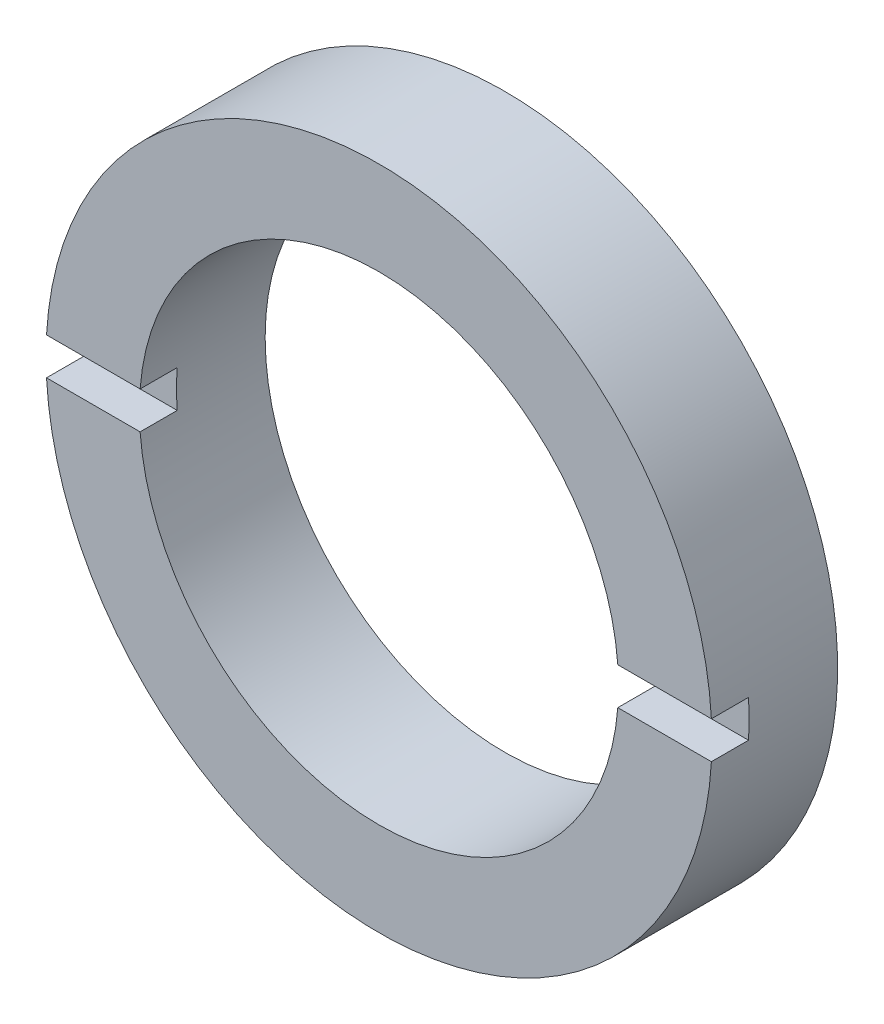
ISO-10303-21;
HEADER;
FILE_DESCRIPTION(('STEP AP214'),'2;1');
FILE_NAME('part.step','',(''),(''),'','','');
FILE_SCHEMA(('AUTOMOTIVE_DESIGN { 1 0 10303 214 1 1 1 1 }'));
ENDSEC;
DATA;
#1=APPLICATION_CONTEXT('core data for automotive mechanical design processes');
#2=APPLICATION_PROTOCOL_DEFINITION('international standard','automotive_design',2000,#1);
#3=PRODUCT_CONTEXT('',#1,'mechanical');
#4=PRODUCT('Part','Part','',(#3));
#5=PRODUCT_RELATED_PRODUCT_CATEGORY('part','',(#4));
#6=PRODUCT_DEFINITION_FORMATION('','',#4);
#7=PRODUCT_DEFINITION_CONTEXT('part definition',#1,'design');
#8=PRODUCT_DEFINITION('design','',#6,#7);
#9=PRODUCT_DEFINITION_SHAPE('','',#8);
#10=(LENGTH_UNIT() NAMED_UNIT(*) SI_UNIT(.MILLI.,.METRE.));
#11=(NAMED_UNIT(*) PLANE_ANGLE_UNIT() SI_UNIT($,.RADIAN.));
#12=(NAMED_UNIT(*) SI_UNIT($,.STERADIAN.) SOLID_ANGLE_UNIT());
#13=UNCERTAINTY_MEASURE_WITH_UNIT(LENGTH_MEASURE(1.E-05),#10,'distance_accuracy_value','');
#14=(GEOMETRIC_REPRESENTATION_CONTEXT(3) GLOBAL_UNCERTAINTY_ASSIGNED_CONTEXT((#13)) GLOBAL_UNIT_ASSIGNED_CONTEXT((#10,
#11,#12)) REPRESENTATION_CONTEXT('',''));
#15=CARTESIAN_POINT('',(0.,0.,0.));
#16=DIRECTION('',(0.,0.,1.));
#17=DIRECTION('',(1.,0.,0.));
#18=AXIS2_PLACEMENT_3D('',#15,#16,#17);
#19=CARTESIAN_POINT('',(0.,-29.0593213562373,0.));
#20=DIRECTION('',(0.,0.,-1.));
#21=DIRECTION('',(0.,-1.,0.));
#22=AXIS2_PLACEMENT_3D('',#19,#20,#21);
#23=PLANE('',#22);
#24=CARTESIAN_POINT('',(0.,0.,0.));
#25=DIRECTION('',(0.,0.,-1.));
#26=DIRECTION('',(-1.,0.,0.));
#27=AXIS2_PLACEMENT_3D('',#24,#25,#26);
#28=CIRCLE('',#27,13.45);
#29=CARTESIAN_POINT('',(13.4290729389634,-0.75,0.));
#30=VERTEX_POINT('',#29);
#31=CARTESIAN_POINT('',(-13.4290729389634,-0.75,0.));
#32=VERTEX_POINT('',#31);
#33=EDGE_CURVE('E188',#30,#32,#28,.T.);
#34=ORIENTED_EDGE('',*,*,#33,.F.);
#35=DIRECTION('',(-1.,0.,0.));
#36=VECTOR('',#35,1.);
#37=CARTESIAN_POINT('',(0.,-0.750000000000001,0.));
#38=LINE('',#37,#36);
#39=CARTESIAN_POINT('',(9.64829367090368,-0.75,0.));
#40=VERTEX_POINT('',#39);
#41=EDGE_CURVE('E149',#30,#40,#38,.T.);
#42=ORIENTED_EDGE('',*,*,#41,.T.);
#43=CARTESIAN_POINT('',(0.,0.,0.));
#44=DIRECTION('',(0.,0.,-1.));
#45=DIRECTION('',(-1.,0.,0.));
#46=AXIS2_PLACEMENT_3D('',#43,#44,#45);
#47=CIRCLE('',#46,9.6774);
#48=CARTESIAN_POINT('',(-9.64829367090368,-0.75,0.));
#49=VERTEX_POINT('',#48);
#50=EDGE_CURVE('E132',#40,#49,#47,.T.);
#51=ORIENTED_EDGE('',*,*,#50,.T.);
#52=EDGE_CURVE('E146',#49,#32,#38,.T.);
#53=ORIENTED_EDGE('',*,*,#52,.T.);
#54=EDGE_LOOP('',(#34,#42,#51,#53));
#55=FACE_BOUND('',#54,.T.);
#56=ADVANCED_FACE('F41',(#55),#23,.F.);
#57=CARTESIAN_POINT('',(0.,0.,37.2803448278363));
#58=DIRECTION('',(0.,0.,-1.));
#59=DIRECTION('',(-1.,0.,0.));
#60=AXIS2_PLACEMENT_3D('',#57,#58,#59);
#61=CYLINDRICAL_SURFACE('',#60,9.6774);
#62=ORIENTED_EDGE('',*,*,#50,.F.);
#63=DIRECTION('',(0.,0.,-1.));
#64=VECTOR('',#63,1.);
#65=CARTESIAN_POINT('',(9.64829367090368,-0.75,37.2803448278363));
#66=LINE('',#65,#64);
#67=CARTESIAN_POINT('',(9.64829367090368,-0.75,-1.5));
#68=VERTEX_POINT('',#67);
#69=EDGE_CURVE('E190',#40,#68,#66,.T.);
#70=ORIENTED_EDGE('',*,*,#69,.T.);
#71=CARTESIAN_POINT('',(0.,0.,-1.5));
#72=DIRECTION('',(0.,0.,-1.));
#73=DIRECTION('',(-1.,0.,0.));
#74=AXIS2_PLACEMENT_3D('',#71,#72,#73);
#75=CIRCLE('',#74,9.6774);
#76=CARTESIAN_POINT('',(9.64829367090368,0.75,-1.5));
#77=VERTEX_POINT('',#76);
#78=EDGE_CURVE('E126',#68,#77,#75,.F.);
#79=ORIENTED_EDGE('',*,*,#78,.T.);
#80=DIRECTION('',(0.,0.,-1.));
#81=VECTOR('',#80,1.);
#82=CARTESIAN_POINT('',(9.64829367090368,0.75,37.2803448278363));
#83=LINE('',#82,#81);
#84=CARTESIAN_POINT('',(9.64829367090368,0.75,0.));
#85=VERTEX_POINT('',#84);
#86=EDGE_CURVE('E108',#77,#85,#83,.F.);
#87=ORIENTED_EDGE('',*,*,#86,.T.);
#88=CARTESIAN_POINT('',(-9.64829367090368,0.750000000000001,0.));
#89=VERTEX_POINT('',#88);
#90=EDGE_CURVE('E124',#89,#85,#47,.T.);
#91=ORIENTED_EDGE('',*,*,#90,.F.);
#92=DIRECTION('',(0.,0.,-1.));
#93=VECTOR('',#92,1.);
#94=CARTESIAN_POINT('',(-9.64829367090368,0.75,37.2803448278363));
#95=LINE('',#94,#93);
#96=CARTESIAN_POINT('',(-9.64829367090368,0.75,-1.5));
#97=VERTEX_POINT('',#96);
#98=EDGE_CURVE('E65',#89,#97,#95,.T.);
#99=ORIENTED_EDGE('',*,*,#98,.T.);
#100=CARTESIAN_POINT('',(-9.64829367090368,-0.75,-1.5));
#101=VERTEX_POINT('',#100);
#102=EDGE_CURVE('E199',#97,#101,#75,.F.);
#103=ORIENTED_EDGE('',*,*,#102,.T.);
#104=DIRECTION('',(0.,0.,-1.));
#105=VECTOR('',#104,1.);
#106=CARTESIAN_POINT('',(-9.64829367090368,-0.75,37.2803448278363));
#107=LINE('',#106,#105);
#108=EDGE_CURVE('E180',#101,#49,#107,.F.);
#109=ORIENTED_EDGE('',*,*,#108,.T.);
#110=EDGE_LOOP('',(#62,#70,#79,#87,#91,#99,#103,#109));
#111=FACE_BOUND('',#110,.T.);
#112=CARTESIAN_POINT('',(0.,0.,-5.08));
#113=DIRECTION('',(0.,0.,-1.));
#114=DIRECTION('',(-1.,0.,0.));
#115=AXIS2_PLACEMENT_3D('',#112,#113,#114);
#116=CIRCLE('',#115,9.6774);
#117=CARTESIAN_POINT('',(-9.6774,0.,-5.08));
#118=VERTEX_POINT('',#117);
#119=EDGE_CURVE('E131',#118,#118,#116,.T.);
#120=ORIENTED_EDGE('',*,*,#119,.T.);
#121=EDGE_LOOP('',(#120));
#122=FACE_BOUND('',#121,.T.);
#123=ADVANCED_FACE('F122',(#111,#122),#61,.F.);
#124=CARTESIAN_POINT('',(0.,0.,37.2803448278363));
#125=DIRECTION('',(0.,0.,-1.));
#126=DIRECTION('',(-1.,0.,0.));
#127=AXIS2_PLACEMENT_3D('',#124,#125,#126);
#128=CYLINDRICAL_SURFACE('',#127,13.45);
#129=DIRECTION('',(0.,0.,-1.));
#130=VECTOR('',#129,1.);
#131=CARTESIAN_POINT('',(13.4290729389634,-0.75,37.2803448278363));
#132=LINE('',#131,#130);
#133=CARTESIAN_POINT('',(13.4290729389634,-0.75,-1.5));
#134=VERTEX_POINT('',#133);
#135=EDGE_CURVE('E128',#30,#134,#132,.T.);
#136=ORIENTED_EDGE('',*,*,#135,.F.);
#137=ORIENTED_EDGE('',*,*,#33,.T.);
#138=DIRECTION('',(0.,0.,-1.));
#139=VECTOR('',#138,1.);
#140=CARTESIAN_POINT('',(-13.4290729389634,-0.75,37.2803448278363));
#141=LINE('',#140,#139);
#142=CARTESIAN_POINT('',(-13.4290729389634,-0.75,-1.5));
#143=VERTEX_POINT('',#142);
#144=EDGE_CURVE('E178',#143,#32,#141,.F.);
#145=ORIENTED_EDGE('',*,*,#144,.F.);
#146=CARTESIAN_POINT('',(0.,0.,-1.5));
#147=DIRECTION('',(0.,0.,-1.));
#148=DIRECTION('',(-1.,0.,0.));
#149=AXIS2_PLACEMENT_3D('',#146,#147,#148);
#150=CIRCLE('',#149,13.45);
#151=CARTESIAN_POINT('',(-13.4290729389634,0.75,-1.5));
#152=VERTEX_POINT('',#151);
#153=EDGE_CURVE('E45',#152,#143,#150,.F.);
#154=ORIENTED_EDGE('',*,*,#153,.F.);
#155=DIRECTION('',(0.,0.,-1.));
#156=VECTOR('',#155,1.);
#157=CARTESIAN_POINT('',(-13.4290729389634,0.75,37.2803448278363));
#158=LINE('',#157,#156);
#159=CARTESIAN_POINT('',(-13.4290729389634,0.75,0.));
#160=VERTEX_POINT('',#159);
#161=EDGE_CURVE('E182',#160,#152,#158,.T.);
#162=ORIENTED_EDGE('',*,*,#161,.F.);
#163=CARTESIAN_POINT('',(13.4290729389634,0.750000000000001,0.));
#164=VERTEX_POINT('',#163);
#165=EDGE_CURVE('E140',#160,#164,#28,.T.);
#166=ORIENTED_EDGE('',*,*,#165,.T.);
#167=DIRECTION('',(0.,0.,-1.));
#168=VECTOR('',#167,1.);
#169=CARTESIAN_POINT('',(13.4290729389634,0.75,37.2803448278363));
#170=LINE('',#169,#168);
#171=CARTESIAN_POINT('',(13.4290729389634,0.75,-1.5));
#172=VERTEX_POINT('',#171);
#173=EDGE_CURVE('E57',#172,#164,#170,.F.);
#174=ORIENTED_EDGE('',*,*,#173,.F.);
#175=EDGE_CURVE('E11',#134,#172,#150,.F.);
#176=ORIENTED_EDGE('',*,*,#175,.F.);
#177=EDGE_LOOP('',(#136,#137,#145,#154,#162,#166,#174,#176));
#178=FACE_BOUND('',#177,.T.);
#179=CARTESIAN_POINT('',(0.,0.,-5.08));
#180=DIRECTION('',(0.,0.,-1.));
#181=DIRECTION('',(-1.,0.,0.));
#182=AXIS2_PLACEMENT_3D('',#179,#180,#181);
#183=CIRCLE('',#182,13.45);
#184=CARTESIAN_POINT('',(-13.45,0.,-5.08));
#185=VERTEX_POINT('',#184);
#186=EDGE_CURVE('E116',#185,#185,#183,.T.);
#187=ORIENTED_EDGE('',*,*,#186,.F.);
#188=EDGE_LOOP('',(#187));
#189=FACE_BOUND('',#188,.T.);
#190=ADVANCED_FACE('F186',(#178,#189),#128,.T.);
#191=CARTESIAN_POINT('',(0.,-29.0593213562373,-5.08));
#192=DIRECTION('',(0.,0.,-1.));
#193=DIRECTION('',(0.,-1.,0.));
#194=AXIS2_PLACEMENT_3D('',#191,#192,#193);
#195=PLANE('',#194);
#196=ORIENTED_EDGE('',*,*,#119,.F.);
#197=EDGE_LOOP('',(#196));
#198=FACE_BOUND('',#197,.T.);
#199=ORIENTED_EDGE('',*,*,#186,.T.);
#200=EDGE_LOOP('',(#199));
#201=FACE_BOUND('',#200,.T.);
#202=ADVANCED_FACE('F238',(#198,#201),#195,.T.);
#203=ORIENTED_EDGE('',*,*,#165,.F.);
#204=DIRECTION('',(1.,0.,0.));
#205=VECTOR('',#204,1.);
#206=CARTESIAN_POINT('',(0.,0.750000000000001,0.));
#207=LINE('',#206,#205);
#208=EDGE_CURVE('E115',#160,#89,#207,.T.);
#209=ORIENTED_EDGE('',*,*,#208,.T.);
#210=ORIENTED_EDGE('',*,*,#90,.T.);
#211=EDGE_CURVE('E105',#85,#164,#207,.T.);
#212=ORIENTED_EDGE('',*,*,#211,.T.);
#213=EDGE_LOOP('',(#203,#209,#210,#212));
#214=FACE_BOUND('',#213,.T.);
#215=ADVANCED_FACE('F43',(#214),#23,.F.);
#216=CARTESIAN_POINT('',(-15.5,0.75,-1.5));
#217=DIRECTION('',(0.,1.,0.));
#218=DIRECTION('',(0.,0.,1.));
#219=AXIS2_PLACEMENT_3D('',#216,#217,#218);
#220=PLANE('',#219);
#221=DIRECTION('',(-1.,0.,0.));
#222=VECTOR('',#221,1.);
#223=CARTESIAN_POINT('',(-15.5,0.75,-1.5));
#224=LINE('',#223,#222);
#225=EDGE_CURVE('E223',#172,#77,#224,.T.);
#226=ORIENTED_EDGE('',*,*,#225,.F.);
#227=ORIENTED_EDGE('',*,*,#173,.T.);
#228=ORIENTED_EDGE('',*,*,#211,.F.);
#229=ORIENTED_EDGE('',*,*,#86,.F.);
#230=EDGE_LOOP('',(#226,#227,#228,#229));
#231=FACE_BOUND('',#230,.T.);
#232=ADVANCED_FACE('F107',(#231),#220,.F.);
#233=CARTESIAN_POINT('',(-15.5,-0.75,-1.5));
#234=DIRECTION('',(0.,-1.,0.));
#235=DIRECTION('',(0.,0.,-1.));
#236=AXIS2_PLACEMENT_3D('',#233,#234,#235);
#237=PLANE('',#236);
#238=ORIENTED_EDGE('',*,*,#41,.F.);
#239=ORIENTED_EDGE('',*,*,#135,.T.);
#240=DIRECTION('',(1.,0.,0.));
#241=VECTOR('',#240,1.);
#242=CARTESIAN_POINT('',(-15.5,-0.75,-1.5));
#243=LINE('',#242,#241);
#244=EDGE_CURVE('E183',#68,#134,#243,.T.);
#245=ORIENTED_EDGE('',*,*,#244,.F.);
#246=ORIENTED_EDGE('',*,*,#69,.F.);
#247=EDGE_LOOP('',(#238,#239,#245,#246));
#248=FACE_BOUND('',#247,.T.);
#249=ADVANCED_FACE('F243',(#248),#237,.F.);
#250=CARTESIAN_POINT('',(0.,0.,-1.5));
#251=DIRECTION('',(0.,0.,-1.));
#252=DIRECTION('',(-1.,0.,0.));
#253=AXIS2_PLACEMENT_3D('',#250,#251,#252);
#254=PLANE('',#253);
#255=ORIENTED_EDGE('',*,*,#244,.T.);
#256=ORIENTED_EDGE('',*,*,#175,.T.);
#257=ORIENTED_EDGE('',*,*,#225,.T.);
#258=ORIENTED_EDGE('',*,*,#78,.F.);
#259=EDGE_LOOP('',(#255,#256,#257,#258));
#260=FACE_BOUND('',#259,.T.);
#261=ADVANCED_FACE('F229',(#260),#254,.F.);
#262=EDGE_CURVE('E172',#97,#152,#224,.T.);
#263=ORIENTED_EDGE('',*,*,#262,.T.);
#264=ORIENTED_EDGE('',*,*,#153,.T.);
#265=EDGE_CURVE('E170',#143,#101,#243,.T.);
#266=ORIENTED_EDGE('',*,*,#265,.T.);
#267=ORIENTED_EDGE('',*,*,#102,.F.);
#268=EDGE_LOOP('',(#263,#264,#266,#267));
#269=FACE_BOUND('',#268,.T.);
#270=ADVANCED_FACE('F169',(#269),#254,.F.);
#271=ORIENTED_EDGE('',*,*,#265,.F.);
#272=ORIENTED_EDGE('',*,*,#144,.T.);
#273=ORIENTED_EDGE('',*,*,#52,.F.);
#274=ORIENTED_EDGE('',*,*,#108,.F.);
#275=EDGE_LOOP('',(#271,#272,#273,#274));
#276=FACE_BOUND('',#275,.T.);
#277=ADVANCED_FACE('F177',(#276),#237,.F.);
#278=ORIENTED_EDGE('',*,*,#208,.F.);
#279=ORIENTED_EDGE('',*,*,#161,.T.);
#280=ORIENTED_EDGE('',*,*,#262,.F.);
#281=ORIENTED_EDGE('',*,*,#98,.F.);
#282=EDGE_LOOP('',(#278,#279,#280,#281));
#283=FACE_BOUND('',#282,.T.);
#284=ADVANCED_FACE('F245',(#283),#220,.F.);
#285=CLOSED_SHELL('',(#56,#123,#190,#202,#215,#232,#249,#261,#270,#277,#284));
#286=MANIFOLD_SOLID_BREP('B2',#285);
#287=ADVANCED_BREP_SHAPE_REPRESENTATION('',(#18,#286),#14);
#288=SHAPE_DEFINITION_REPRESENTATION(#9,#287);
ENDSEC;
END-ISO-10303-21;
